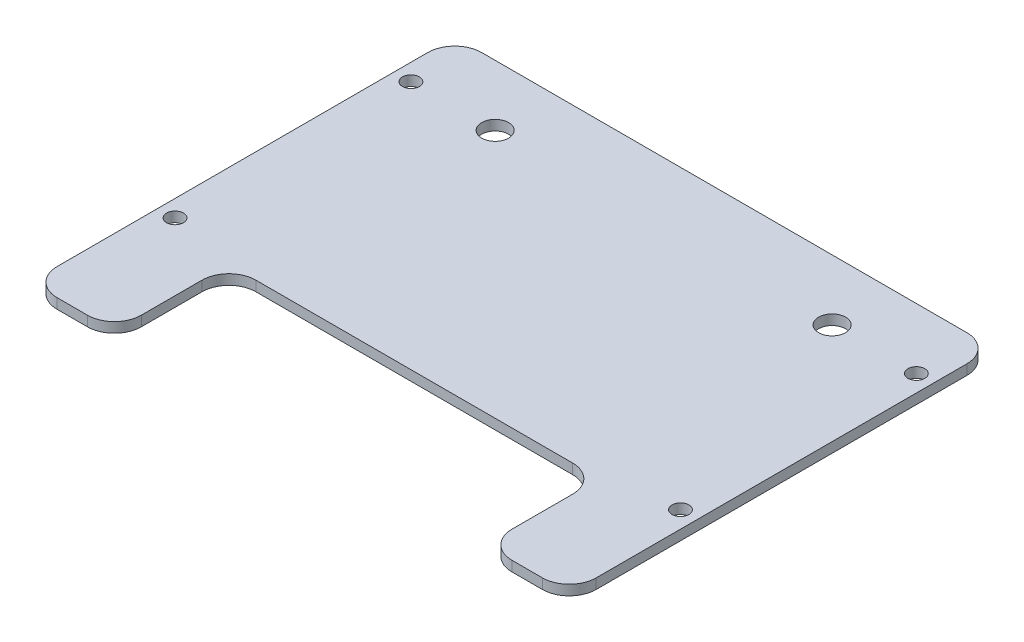
ISO-10303-21;
HEADER;
FILE_DESCRIPTION(('STEP AP214'),'2;1');
FILE_NAME('part.step','',(''),(''),'','','');
FILE_SCHEMA(('AUTOMOTIVE_DESIGN { 1 0 10303 214 1 1 1 1 }'));
ENDSEC;
DATA;
#1=APPLICATION_CONTEXT('core data for automotive mechanical design processes');
#2=APPLICATION_PROTOCOL_DEFINITION('international standard','automotive_design',2000,#1);
#3=PRODUCT_CONTEXT('',#1,'mechanical');
#4=PRODUCT('Part','Part','',(#3));
#5=PRODUCT_RELATED_PRODUCT_CATEGORY('part','',(#4));
#6=PRODUCT_DEFINITION_FORMATION('','',#4);
#7=PRODUCT_DEFINITION_CONTEXT('part definition',#1,'design');
#8=PRODUCT_DEFINITION('design','',#6,#7);
#9=PRODUCT_DEFINITION_SHAPE('','',#8);
#10=(LENGTH_UNIT() NAMED_UNIT(*) SI_UNIT(.MILLI.,.METRE.));
#11=(NAMED_UNIT(*) PLANE_ANGLE_UNIT() SI_UNIT($,.RADIAN.));
#12=(NAMED_UNIT(*) SI_UNIT($,.STERADIAN.) SOLID_ANGLE_UNIT());
#13=UNCERTAINTY_MEASURE_WITH_UNIT(LENGTH_MEASURE(1.E-05),#10,'distance_accuracy_value','');
#14=(GEOMETRIC_REPRESENTATION_CONTEXT(3) GLOBAL_UNCERTAINTY_ASSIGNED_CONTEXT((#13)) GLOBAL_UNIT_ASSIGNED_CONTEXT((#10,
#11,#12)) REPRESENTATION_CONTEXT('',''));
#15=CARTESIAN_POINT('',(0.,0.,0.));
#16=DIRECTION('',(0.,0.,1.));
#17=DIRECTION('',(1.,0.,0.));
#18=AXIS2_PLACEMENT_3D('',#15,#16,#17);
#19=CARTESIAN_POINT('',(-40.,1.5,63.));
#20=DIRECTION('',(0.,0.,-1.));
#21=DIRECTION('',(-1.,0.,0.));
#22=AXIS2_PLACEMENT_3D('',#19,#20,#21);
#23=PLANE('',#22);
#24=DIRECTION('',(1.,0.,0.));
#25=VECTOR('',#24,1.);
#26=CARTESIAN_POINT('',(-40.,0.,63.));
#27=LINE('',#26,#25);
#28=CARTESIAN_POINT('',(-36.,0.,63.));
#29=VERTEX_POINT('',#28);
#30=CARTESIAN_POINT('',(-31.5,0.,63.));
#31=VERTEX_POINT('',#30);
#32=EDGE_CURVE('E178',#29,#31,#27,.T.);
#33=ORIENTED_EDGE('',*,*,#32,.T.);
#34=DIRECTION('',(0.,1.,0.));
#35=VECTOR('',#34,1.);
#36=CARTESIAN_POINT('',(-31.5,1.5,63.));
#37=LINE('',#36,#35);
#38=CARTESIAN_POINT('',(-31.5,1.5,63.));
#39=VERTEX_POINT('',#38);
#40=EDGE_CURVE('E240',#31,#39,#37,.T.);
#41=ORIENTED_EDGE('',*,*,#40,.T.);
#42=DIRECTION('',(1.,0.,0.));
#43=VECTOR('',#42,1.);
#44=CARTESIAN_POINT('',(-40.,1.5,63.));
#45=LINE('',#44,#43);
#46=CARTESIAN_POINT('',(-36.,1.5,63.));
#47=VERTEX_POINT('',#46);
#48=EDGE_CURVE('E285',#47,#39,#45,.T.);
#49=ORIENTED_EDGE('',*,*,#48,.F.);
#50=DIRECTION('',(0.,-1.,0.));
#51=VECTOR('',#50,1.);
#52=CARTESIAN_POINT('',(-36.,1.5,63.));
#53=LINE('',#52,#51);
#54=EDGE_CURVE('E237',#47,#29,#53,.T.);
#55=ORIENTED_EDGE('',*,*,#54,.T.);
#56=EDGE_LOOP('',(#33,#41,#49,#55));
#57=FACE_BOUND('',#56,.T.);
#58=ADVANCED_FACE('F34',(#57),#23,.F.);
#59=CARTESIAN_POINT('',(-40.,1.5,63.));
#60=DIRECTION('',(1.,0.,0.));
#61=DIRECTION('',(0.,0.,-1.));
#62=AXIS2_PLACEMENT_3D('',#59,#60,#61);
#63=PLANE('',#62);
#64=DIRECTION('',(0.,0.,1.));
#65=VECTOR('',#64,1.);
#66=CARTESIAN_POINT('',(-40.,1.5,63.));
#67=LINE('',#66,#65);
#68=CARTESIAN_POINT('',(-40.,1.5,4.));
#69=VERTEX_POINT('',#68);
#70=CARTESIAN_POINT('',(-40.,1.5,59.));
#71=VERTEX_POINT('',#70);
#72=EDGE_CURVE('E168',#69,#71,#67,.T.);
#73=ORIENTED_EDGE('',*,*,#72,.F.);
#74=DIRECTION('',(0.,-1.,0.));
#75=VECTOR('',#74,1.);
#76=CARTESIAN_POINT('',(-40.,1.5,4.));
#77=LINE('',#76,#75);
#78=CARTESIAN_POINT('',(-40.,0.,4.));
#79=VERTEX_POINT('',#78);
#80=EDGE_CURVE('E152',#69,#79,#77,.T.);
#81=ORIENTED_EDGE('',*,*,#80,.T.);
#82=DIRECTION('',(0.,0.,1.));
#83=VECTOR('',#82,1.);
#84=CARTESIAN_POINT('',(-40.,0.,63.));
#85=LINE('',#84,#83);
#86=CARTESIAN_POINT('',(-40.,0.,59.));
#87=VERTEX_POINT('',#86);
#88=EDGE_CURVE('E165',#79,#87,#85,.T.);
#89=ORIENTED_EDGE('',*,*,#88,.T.);
#90=DIRECTION('',(0.,-1.,0.));
#91=VECTOR('',#90,1.);
#92=CARTESIAN_POINT('',(-40.,1.5,59.));
#93=LINE('',#92,#91);
#94=EDGE_CURVE('E170',#87,#71,#93,.F.);
#95=ORIENTED_EDGE('',*,*,#94,.T.);
#96=EDGE_LOOP('',(#73,#81,#89,#95));
#97=FACE_BOUND('',#96,.T.);
#98=ADVANCED_FACE('F164',(#97),#63,.F.);
#99=CARTESIAN_POINT('',(31.5,0.,63.));
#100=VERTEX_POINT('',#99);
#101=CARTESIAN_POINT('',(36.,0.,63.));
#102=VERTEX_POINT('',#101);
#103=EDGE_CURVE('E174',#100,#102,#27,.T.);
#104=ORIENTED_EDGE('',*,*,#103,.T.);
#105=DIRECTION('',(0.,-1.,0.));
#106=VECTOR('',#105,1.);
#107=CARTESIAN_POINT('',(36.,1.5,63.));
#108=LINE('',#107,#106);
#109=CARTESIAN_POINT('',(36.,1.5,63.));
#110=VERTEX_POINT('',#109);
#111=EDGE_CURVE('E230',#102,#110,#108,.F.);
#112=ORIENTED_EDGE('',*,*,#111,.T.);
#113=CARTESIAN_POINT('',(31.5,1.5,63.));
#114=VERTEX_POINT('',#113);
#115=EDGE_CURVE('E284',#114,#110,#45,.T.);
#116=ORIENTED_EDGE('',*,*,#115,.F.);
#117=DIRECTION('',(0.,1.,0.));
#118=VECTOR('',#117,1.);
#119=CARTESIAN_POINT('',(31.5,1.5,63.));
#120=LINE('',#119,#118);
#121=EDGE_CURVE('E228',#114,#100,#120,.F.);
#122=ORIENTED_EDGE('',*,*,#121,.T.);
#123=EDGE_LOOP('',(#104,#112,#116,#122));
#124=FACE_BOUND('',#123,.T.);
#125=ADVANCED_FACE('F311',(#124),#23,.F.);
#126=CARTESIAN_POINT('',(40.,1.5,63.));
#127=DIRECTION('',(-1.,0.,0.));
#128=DIRECTION('',(0.,0.,1.));
#129=AXIS2_PLACEMENT_3D('',#126,#127,#128);
#130=PLANE('',#129);
#131=DIRECTION('',(0.,0.,-1.));
#132=VECTOR('',#131,1.);
#133=CARTESIAN_POINT('',(40.,0.,63.));
#134=LINE('',#133,#132);
#135=CARTESIAN_POINT('',(40.,0.,59.));
#136=VERTEX_POINT('',#135);
#137=CARTESIAN_POINT('',(40.,0.,4.));
#138=VERTEX_POINT('',#137);
#139=EDGE_CURVE('E187',#136,#138,#134,.T.);
#140=ORIENTED_EDGE('',*,*,#139,.T.);
#141=DIRECTION('',(0.,-1.,0.));
#142=VECTOR('',#141,1.);
#143=CARTESIAN_POINT('',(40.,1.5,4.));
#144=LINE('',#143,#142);
#145=CARTESIAN_POINT('',(40.,1.5,4.));
#146=VERTEX_POINT('',#145);
#147=EDGE_CURVE('E49',#138,#146,#144,.F.);
#148=ORIENTED_EDGE('',*,*,#147,.T.);
#149=DIRECTION('',(0.,0.,-1.));
#150=VECTOR('',#149,1.);
#151=CARTESIAN_POINT('',(40.,1.5,63.));
#152=LINE('',#151,#150);
#153=CARTESIAN_POINT('',(40.,1.5,59.));
#154=VERTEX_POINT('',#153);
#155=EDGE_CURVE('E286',#154,#146,#152,.T.);
#156=ORIENTED_EDGE('',*,*,#155,.F.);
#157=DIRECTION('',(0.,-1.,0.));
#158=VECTOR('',#157,1.);
#159=CARTESIAN_POINT('',(40.,1.5,59.));
#160=LINE('',#159,#158);
#161=EDGE_CURVE('E224',#154,#136,#160,.T.);
#162=ORIENTED_EDGE('',*,*,#161,.T.);
#163=EDGE_LOOP('',(#140,#148,#156,#162));
#164=FACE_BOUND('',#163,.T.);
#165=ADVANCED_FACE('F303',(#164),#130,.F.);
#166=CARTESIAN_POINT('',(-40.,1.5,0.));
#167=DIRECTION('',(0.,0.,1.));
#168=DIRECTION('',(1.,0.,0.));
#169=AXIS2_PLACEMENT_3D('',#166,#167,#168);
#170=PLANE('',#169);
#171=DIRECTION('',(-1.,0.,0.));
#172=VECTOR('',#171,1.);
#173=CARTESIAN_POINT('',(-40.,0.,0.));
#174=LINE('',#173,#172);
#175=CARTESIAN_POINT('',(36.,0.,0.));
#176=VERTEX_POINT('',#175);
#177=CARTESIAN_POINT('',(-36.,0.,0.));
#178=VERTEX_POINT('',#177);
#179=EDGE_CURVE('E189',#176,#178,#174,.T.);
#180=ORIENTED_EDGE('',*,*,#179,.T.);
#181=DIRECTION('',(0.,-1.,0.));
#182=VECTOR('',#181,1.);
#183=CARTESIAN_POINT('',(-36.,1.5,0.));
#184=LINE('',#183,#182);
#185=CARTESIAN_POINT('',(-36.,1.5,0.));
#186=VERTEX_POINT('',#185);
#187=EDGE_CURVE('E153',#178,#186,#184,.F.);
#188=ORIENTED_EDGE('',*,*,#187,.T.);
#189=DIRECTION('',(-1.,0.,0.));
#190=VECTOR('',#189,1.);
#191=CARTESIAN_POINT('',(-40.,1.5,0.));
#192=LINE('',#191,#190);
#193=CARTESIAN_POINT('',(36.,1.5,0.));
#194=VERTEX_POINT('',#193);
#195=EDGE_CURVE('E184',#194,#186,#192,.T.);
#196=ORIENTED_EDGE('',*,*,#195,.F.);
#197=DIRECTION('',(0.,-1.,0.));
#198=VECTOR('',#197,1.);
#199=CARTESIAN_POINT('',(36.,1.5,0.));
#200=LINE('',#199,#198);
#201=EDGE_CURVE('E158',#194,#176,#200,.T.);
#202=ORIENTED_EDGE('',*,*,#201,.T.);
#203=EDGE_LOOP('',(#180,#188,#196,#202));
#204=FACE_BOUND('',#203,.T.);
#205=ADVANCED_FACE('F299',(#204),#170,.F.);
#206=CARTESIAN_POINT('',(0.,1.5,0.));
#207=DIRECTION('',(0.,-1.,0.));
#208=DIRECTION('',(0.,0.,-1.));
#209=AXIS2_PLACEMENT_3D('',#206,#207,#208);
#210=PLANE('',#209);
#211=CARTESIAN_POINT('',(37.5,1.5,44.));
#212=DIRECTION('',(0.,1.,0.));
#213=DIRECTION('',(0.,0.,-1.));
#214=AXIS2_PLACEMENT_3D('',#211,#212,#213);
#215=CIRCLE('',#214,1.25);
#216=CARTESIAN_POINT('',(37.5,1.5,42.75));
#217=VERTEX_POINT('',#216);
#218=EDGE_CURVE('E392',#217,#217,#215,.T.);
#219=ORIENTED_EDGE('',*,*,#218,.F.);
#220=EDGE_LOOP('',(#219));
#221=FACE_BOUND('',#220,.T.);
#222=CARTESIAN_POINT('',(37.5,1.5,9.00000000000001));
#223=DIRECTION('',(0.,1.,0.));
#224=DIRECTION('',(0.,0.,-1.));
#225=AXIS2_PLACEMENT_3D('',#222,#223,#224);
#226=CIRCLE('',#225,1.25);
#227=CARTESIAN_POINT('',(37.5,1.5,7.75));
#228=VERTEX_POINT('',#227);
#229=EDGE_CURVE('E394',#228,#228,#226,.T.);
#230=ORIENTED_EDGE('',*,*,#229,.F.);
#231=EDGE_LOOP('',(#230));
#232=FACE_BOUND('',#231,.T.);
#233=CARTESIAN_POINT('',(25.,1.5,9.00000000000001));
#234=DIRECTION('',(0.,1.,0.));
#235=DIRECTION('',(0.,0.,-1.));
#236=AXIS2_PLACEMENT_3D('',#233,#234,#235);
#237=CIRCLE('',#236,2.);
#238=CARTESIAN_POINT('',(25.,1.5,7.00000000000001));
#239=VERTEX_POINT('',#238);
#240=EDGE_CURVE('E400',#239,#239,#237,.T.);
#241=ORIENTED_EDGE('',*,*,#240,.F.);
#242=EDGE_LOOP('',(#241));
#243=FACE_BOUND('',#242,.T.);
#244=CARTESIAN_POINT('',(-25.,1.5,9.00000000000001));
#245=DIRECTION('',(0.,1.,0.));
#246=DIRECTION('',(0.,0.,1.));
#247=AXIS2_PLACEMENT_3D('',#244,#245,#246);
#248=CIRCLE('',#247,2.);
#249=CARTESIAN_POINT('',(-25.,1.5,11.));
#250=VERTEX_POINT('',#249);
#251=EDGE_CURVE('E406',#250,#250,#248,.T.);
#252=ORIENTED_EDGE('',*,*,#251,.F.);
#253=EDGE_LOOP('',(#252));
#254=FACE_BOUND('',#253,.T.);
#255=CARTESIAN_POINT('',(-37.5,1.5,9.00000000000001));
#256=DIRECTION('',(0.,1.,0.));
#257=DIRECTION('',(0.,0.,1.));
#258=AXIS2_PLACEMENT_3D('',#255,#256,#257);
#259=CIRCLE('',#258,1.25);
#260=CARTESIAN_POINT('',(-37.5,1.5,10.25));
#261=VERTEX_POINT('',#260);
#262=EDGE_CURVE('E412',#261,#261,#259,.T.);
#263=ORIENTED_EDGE('',*,*,#262,.F.);
#264=EDGE_LOOP('',(#263));
#265=FACE_BOUND('',#264,.T.);
#266=CARTESIAN_POINT('',(-37.5,1.5,44.));
#267=DIRECTION('',(0.,1.,0.));
#268=DIRECTION('',(0.,0.,1.));
#269=AXIS2_PLACEMENT_3D('',#266,#267,#268);
#270=CIRCLE('',#269,1.25);
#271=CARTESIAN_POINT('',(-37.5,1.5,45.25));
#272=VERTEX_POINT('',#271);
#273=EDGE_CURVE('E276',#272,#272,#270,.T.);
#274=ORIENTED_EDGE('',*,*,#273,.F.);
#275=EDGE_LOOP('',(#274));
#276=FACE_BOUND('',#275,.T.);
#277=ORIENTED_EDGE('',*,*,#195,.T.);
#278=CARTESIAN_POINT('',(-36.,1.5,4.));
#279=DIRECTION('',(0.,-1.,0.));
#280=DIRECTION('',(0.,0.,-1.));
#281=AXIS2_PLACEMENT_3D('',#278,#279,#280);
#282=CIRCLE('',#281,4.);
#283=EDGE_CURVE('E212',#186,#69,#282,.F.);
#284=ORIENTED_EDGE('',*,*,#283,.T.);
#285=ORIENTED_EDGE('',*,*,#72,.T.);
#286=CARTESIAN_POINT('',(-36.,1.5,59.));
#287=DIRECTION('',(0.,-1.,0.));
#288=DIRECTION('',(0.,0.,-1.));
#289=AXIS2_PLACEMENT_3D('',#286,#287,#288);
#290=CIRCLE('',#289,4.);
#291=EDGE_CURVE('E203',#71,#47,#290,.F.);
#292=ORIENTED_EDGE('',*,*,#291,.T.);
#293=ORIENTED_EDGE('',*,*,#48,.T.);
#294=CARTESIAN_POINT('',(-31.5,1.5,59.));
#295=DIRECTION('',(0.,-1.,0.));
#296=DIRECTION('',(0.,0.,-1.));
#297=AXIS2_PLACEMENT_3D('',#294,#295,#296);
#298=CIRCLE('',#297,4.);
#299=CARTESIAN_POINT('',(-27.5,1.5,59.));
#300=VERTEX_POINT('',#299);
#301=EDGE_CURVE('E205',#39,#300,#298,.F.);
#302=ORIENTED_EDGE('',*,*,#301,.T.);
#303=DIRECTION('',(0.,0.,1.));
#304=VECTOR('',#303,1.);
#305=CARTESIAN_POINT('',(-27.5,1.5,63.));
#306=LINE('',#305,#304);
#307=CARTESIAN_POINT('',(-27.5,1.5,50.));
#308=VERTEX_POINT('',#307);
#309=EDGE_CURVE('E253',#308,#300,#306,.T.);
#310=ORIENTED_EDGE('',*,*,#309,.F.);
#311=CARTESIAN_POINT('',(-23.5,1.5,50.));
#312=DIRECTION('',(0.,-1.,0.));
#313=DIRECTION('',(0.,0.,-1.));
#314=AXIS2_PLACEMENT_3D('',#311,#312,#313);
#315=CIRCLE('',#314,4.);
#316=CARTESIAN_POINT('',(-23.5,1.5,46.));
#317=VERTEX_POINT('',#316);
#318=EDGE_CURVE('E42',#308,#317,#315,.T.);
#319=ORIENTED_EDGE('',*,*,#318,.T.);
#320=DIRECTION('',(-1.,0.,0.));
#321=VECTOR('',#320,1.);
#322=CARTESIAN_POINT('',(-27.5,1.5,46.));
#323=LINE('',#322,#321);
#324=CARTESIAN_POINT('',(23.5,1.5,46.));
#325=VERTEX_POINT('',#324);
#326=EDGE_CURVE('E251',#325,#317,#323,.T.);
#327=ORIENTED_EDGE('',*,*,#326,.F.);
#328=CARTESIAN_POINT('',(23.5,1.5,50.));
#329=DIRECTION('',(0.,-1.,0.));
#330=DIRECTION('',(0.,0.,-1.));
#331=AXIS2_PLACEMENT_3D('',#328,#329,#330);
#332=CIRCLE('',#331,4.);
#333=CARTESIAN_POINT('',(27.5,1.5,50.));
#334=VERTEX_POINT('',#333);
#335=EDGE_CURVE('E243',#325,#334,#332,.T.);
#336=ORIENTED_EDGE('',*,*,#335,.T.);
#337=DIRECTION('',(0.,0.,-1.));
#338=VECTOR('',#337,1.);
#339=CARTESIAN_POINT('',(27.5,1.5,63.));
#340=LINE('',#339,#338);
#341=CARTESIAN_POINT('',(27.5,1.5,59.));
#342=VERTEX_POINT('',#341);
#343=EDGE_CURVE('E262',#342,#334,#340,.T.);
#344=ORIENTED_EDGE('',*,*,#343,.F.);
#345=CARTESIAN_POINT('',(31.5,1.5,59.));
#346=DIRECTION('',(0.,-1.,0.));
#347=DIRECTION('',(0.,0.,-1.));
#348=AXIS2_PLACEMENT_3D('',#345,#346,#347);
#349=CIRCLE('',#348,4.);
#350=EDGE_CURVE('E207',#342,#114,#349,.F.);
#351=ORIENTED_EDGE('',*,*,#350,.T.);
#352=ORIENTED_EDGE('',*,*,#115,.T.);
#353=CARTESIAN_POINT('',(36.,1.5,59.));
#354=DIRECTION('',(0.,-1.,0.));
#355=DIRECTION('',(0.,0.,-1.));
#356=AXIS2_PLACEMENT_3D('',#353,#354,#355);
#357=CIRCLE('',#356,4.);
#358=EDGE_CURVE('E56',#110,#154,#357,.F.);
#359=ORIENTED_EDGE('',*,*,#358,.T.);
#360=ORIENTED_EDGE('',*,*,#155,.T.);
#361=CARTESIAN_POINT('',(36.,1.5,4.));
#362=DIRECTION('',(0.,-1.,0.));
#363=DIRECTION('',(0.,0.,-1.));
#364=AXIS2_PLACEMENT_3D('',#361,#362,#363);
#365=CIRCLE('',#364,4.);
#366=EDGE_CURVE('E210',#146,#194,#365,.F.);
#367=ORIENTED_EDGE('',*,*,#366,.T.);
#368=EDGE_LOOP('',(#277,#284,#285,#292,#293,#302,#310,#319,#327,#336,#344,#351,#352,#359,#360,#367));
#369=FACE_BOUND('',#368,.T.);
#370=ADVANCED_FACE('F250',(#221,#232,#243,#254,#265,#276,#369),#210,.F.);
#371=CARTESIAN_POINT('',(0.,0.,0.));
#372=DIRECTION('',(0.,-1.,0.));
#373=DIRECTION('',(0.,0.,-1.));
#374=AXIS2_PLACEMENT_3D('',#371,#372,#373);
#375=PLANE('',#374);
#376=CARTESIAN_POINT('',(37.5,0.,44.));
#377=DIRECTION('',(0.,1.,0.));
#378=DIRECTION('',(0.,0.,-1.));
#379=AXIS2_PLACEMENT_3D('',#376,#377,#378);
#380=CIRCLE('',#379,1.25);
#381=CARTESIAN_POINT('',(37.5,0.,42.75));
#382=VERTEX_POINT('',#381);
#383=EDGE_CURVE('E389',#382,#382,#380,.T.);
#384=ORIENTED_EDGE('',*,*,#383,.T.);
#385=EDGE_LOOP('',(#384));
#386=FACE_BOUND('',#385,.T.);
#387=CARTESIAN_POINT('',(37.5,0.,9.00000000000001));
#388=DIRECTION('',(0.,1.,0.));
#389=DIRECTION('',(0.,0.,-1.));
#390=AXIS2_PLACEMENT_3D('',#387,#388,#389);
#391=CIRCLE('',#390,1.25);
#392=CARTESIAN_POINT('',(37.5,0.,7.75));
#393=VERTEX_POINT('',#392);
#394=EDGE_CURVE('E397',#393,#393,#391,.T.);
#395=ORIENTED_EDGE('',*,*,#394,.T.);
#396=EDGE_LOOP('',(#395));
#397=FACE_BOUND('',#396,.T.);
#398=CARTESIAN_POINT('',(25.,0.,9.00000000000001));
#399=DIRECTION('',(0.,1.,0.));
#400=DIRECTION('',(0.,0.,-1.));
#401=AXIS2_PLACEMENT_3D('',#398,#399,#400);
#402=CIRCLE('',#401,2.);
#403=CARTESIAN_POINT('',(25.,0.,7.00000000000001));
#404=VERTEX_POINT('',#403);
#405=EDGE_CURVE('E403',#404,#404,#402,.T.);
#406=ORIENTED_EDGE('',*,*,#405,.T.);
#407=EDGE_LOOP('',(#406));
#408=FACE_BOUND('',#407,.T.);
#409=CARTESIAN_POINT('',(-25.,0.,9.00000000000001));
#410=DIRECTION('',(0.,1.,0.));
#411=DIRECTION('',(0.,0.,1.));
#412=AXIS2_PLACEMENT_3D('',#409,#410,#411);
#413=CIRCLE('',#412,2.);
#414=CARTESIAN_POINT('',(-25.,0.,11.));
#415=VERTEX_POINT('',#414);
#416=EDGE_CURVE('E409',#415,#415,#413,.T.);
#417=ORIENTED_EDGE('',*,*,#416,.T.);
#418=EDGE_LOOP('',(#417));
#419=FACE_BOUND('',#418,.T.);
#420=CARTESIAN_POINT('',(-37.5,0.,9.00000000000001));
#421=DIRECTION('',(0.,1.,0.));
#422=DIRECTION('',(0.,0.,1.));
#423=AXIS2_PLACEMENT_3D('',#420,#421,#422);
#424=CIRCLE('',#423,1.25);
#425=CARTESIAN_POINT('',(-37.5,0.,10.25));
#426=VERTEX_POINT('',#425);
#427=EDGE_CURVE('E415',#426,#426,#424,.T.);
#428=ORIENTED_EDGE('',*,*,#427,.T.);
#429=EDGE_LOOP('',(#428));
#430=FACE_BOUND('',#429,.T.);
#431=CARTESIAN_POINT('',(-37.5,0.,44.));
#432=DIRECTION('',(0.,1.,0.));
#433=DIRECTION('',(0.,0.,1.));
#434=AXIS2_PLACEMENT_3D('',#431,#432,#433);
#435=CIRCLE('',#434,1.25);
#436=CARTESIAN_POINT('',(-37.5,0.,45.25));
#437=VERTEX_POINT('',#436);
#438=EDGE_CURVE('E280',#437,#437,#435,.T.);
#439=ORIENTED_EDGE('',*,*,#438,.T.);
#440=EDGE_LOOP('',(#439));
#441=FACE_BOUND('',#440,.T.);
#442=ORIENTED_EDGE('',*,*,#88,.F.);
#443=CARTESIAN_POINT('',(-36.,0.,4.));
#444=DIRECTION('',(0.,-1.,0.));
#445=DIRECTION('',(0.,0.,-1.));
#446=AXIS2_PLACEMENT_3D('',#443,#444,#445);
#447=CIRCLE('',#446,4.);
#448=EDGE_CURVE('E148',#79,#178,#447,.T.);
#449=ORIENTED_EDGE('',*,*,#448,.T.);
#450=ORIENTED_EDGE('',*,*,#179,.F.);
#451=CARTESIAN_POINT('',(36.,0.,4.));
#452=DIRECTION('',(0.,-1.,0.));
#453=DIRECTION('',(0.,0.,-1.));
#454=AXIS2_PLACEMENT_3D('',#451,#452,#453);
#455=CIRCLE('',#454,4.);
#456=EDGE_CURVE('E159',#176,#138,#455,.T.);
#457=ORIENTED_EDGE('',*,*,#456,.T.);
#458=ORIENTED_EDGE('',*,*,#139,.F.);
#459=CARTESIAN_POINT('',(36.,0.,59.));
#460=DIRECTION('',(0.,-1.,0.));
#461=DIRECTION('',(0.,0.,-1.));
#462=AXIS2_PLACEMENT_3D('',#459,#460,#461);
#463=CIRCLE('',#462,4.);
#464=EDGE_CURVE('E197',#136,#102,#463,.T.);
#465=ORIENTED_EDGE('',*,*,#464,.T.);
#466=ORIENTED_EDGE('',*,*,#103,.F.);
#467=CARTESIAN_POINT('',(31.5,0.,59.));
#468=DIRECTION('',(0.,-1.,0.));
#469=DIRECTION('',(0.,0.,-1.));
#470=AXIS2_PLACEMENT_3D('',#467,#468,#469);
#471=CIRCLE('',#470,4.);
#472=CARTESIAN_POINT('',(27.5,0.,59.));
#473=VERTEX_POINT('',#472);
#474=EDGE_CURVE('E195',#100,#473,#471,.T.);
#475=ORIENTED_EDGE('',*,*,#474,.T.);
#476=DIRECTION('',(0.,0.,-1.));
#477=VECTOR('',#476,1.);
#478=CARTESIAN_POINT('',(27.5,0.,63.));
#479=LINE('',#478,#477);
#480=CARTESIAN_POINT('',(27.5,0.,50.));
#481=VERTEX_POINT('',#480);
#482=EDGE_CURVE('E181',#473,#481,#479,.T.);
#483=ORIENTED_EDGE('',*,*,#482,.T.);
#484=CARTESIAN_POINT('',(23.5,0.,50.));
#485=DIRECTION('',(0.,-1.,0.));
#486=DIRECTION('',(0.,0.,-1.));
#487=AXIS2_PLACEMENT_3D('',#484,#485,#486);
#488=CIRCLE('',#487,4.);
#489=CARTESIAN_POINT('',(23.5,0.,46.));
#490=VERTEX_POINT('',#489);
#491=EDGE_CURVE('E245',#481,#490,#488,.F.);
#492=ORIENTED_EDGE('',*,*,#491,.T.);
#493=DIRECTION('',(-1.,0.,0.));
#494=VECTOR('',#493,1.);
#495=CARTESIAN_POINT('',(-27.5,0.,46.));
#496=LINE('',#495,#494);
#497=CARTESIAN_POINT('',(-23.5,0.,46.));
#498=VERTEX_POINT('',#497);
#499=EDGE_CURVE('E175',#490,#498,#496,.T.);
#500=ORIENTED_EDGE('',*,*,#499,.T.);
#501=CARTESIAN_POINT('',(-23.5,0.,50.));
#502=DIRECTION('',(0.,-1.,0.));
#503=DIRECTION('',(0.,0.,-1.));
#504=AXIS2_PLACEMENT_3D('',#501,#502,#503);
#505=CIRCLE('',#504,4.);
#506=CARTESIAN_POINT('',(-27.5,0.,50.));
#507=VERTEX_POINT('',#506);
#508=EDGE_CURVE('E11',#498,#507,#505,.F.);
#509=ORIENTED_EDGE('',*,*,#508,.T.);
#510=DIRECTION('',(0.,0.,1.));
#511=VECTOR('',#510,1.);
#512=CARTESIAN_POINT('',(-27.5,0.,63.));
#513=LINE('',#512,#511);
#514=CARTESIAN_POINT('',(-27.5,0.,59.));
#515=VERTEX_POINT('',#514);
#516=EDGE_CURVE('E261',#507,#515,#513,.T.);
#517=ORIENTED_EDGE('',*,*,#516,.T.);
#518=CARTESIAN_POINT('',(-31.5,0.,59.));
#519=DIRECTION('',(0.,-1.,0.));
#520=DIRECTION('',(0.,0.,-1.));
#521=AXIS2_PLACEMENT_3D('',#518,#519,#520);
#522=CIRCLE('',#521,4.);
#523=EDGE_CURVE('E193',#515,#31,#522,.T.);
#524=ORIENTED_EDGE('',*,*,#523,.T.);
#525=ORIENTED_EDGE('',*,*,#32,.F.);
#526=CARTESIAN_POINT('',(-36.,0.,59.));
#527=DIRECTION('',(0.,-1.,0.));
#528=DIRECTION('',(0.,0.,-1.));
#529=AXIS2_PLACEMENT_3D('',#526,#527,#528);
#530=CIRCLE('',#529,4.);
#531=EDGE_CURVE('E169',#29,#87,#530,.T.);
#532=ORIENTED_EDGE('',*,*,#531,.T.);
#533=EDGE_LOOP('',(#442,#449,#450,#457,#458,#465,#466,#475,#483,#492,#500,#509,#517,#524,#525,#532));
#534=FACE_BOUND('',#533,.T.);
#535=ADVANCED_FACE('F172',(#386,#397,#408,#419,#430,#441,#534),#375,.T.);
#536=CARTESIAN_POINT('',(-27.5,0.,63.));
#537=DIRECTION('',(-1.,0.,0.));
#538=DIRECTION('',(0.,0.,1.));
#539=AXIS2_PLACEMENT_3D('',#536,#537,#538);
#540=PLANE('',#539);
#541=ORIENTED_EDGE('',*,*,#516,.F.);
#542=DIRECTION('',(0.,1.,0.));
#543=VECTOR('',#542,1.);
#544=CARTESIAN_POINT('',(-27.5,1.5,50.));
#545=LINE('',#544,#543);
#546=EDGE_CURVE('E234',#507,#308,#545,.T.);
#547=ORIENTED_EDGE('',*,*,#546,.T.);
#548=ORIENTED_EDGE('',*,*,#309,.T.);
#549=DIRECTION('',(0.,1.,0.));
#550=VECTOR('',#549,1.);
#551=CARTESIAN_POINT('',(-27.5,0.,59.));
#552=LINE('',#551,#550);
#553=EDGE_CURVE('E232',#300,#515,#552,.F.);
#554=ORIENTED_EDGE('',*,*,#553,.T.);
#555=EDGE_LOOP('',(#541,#547,#548,#554));
#556=FACE_BOUND('',#555,.T.);
#557=ADVANCED_FACE('F270',(#556),#540,.F.);
#558=CARTESIAN_POINT('',(-27.5,0.,46.));
#559=DIRECTION('',(0.,0.,-1.));
#560=DIRECTION('',(-1.,0.,0.));
#561=AXIS2_PLACEMENT_3D('',#558,#559,#560);
#562=PLANE('',#561);
#563=ORIENTED_EDGE('',*,*,#499,.F.);
#564=DIRECTION('',(0.,1.,0.));
#565=VECTOR('',#564,1.);
#566=CARTESIAN_POINT('',(23.5,1.5,46.));
#567=LINE('',#566,#565);
#568=EDGE_CURVE('E216',#490,#325,#567,.T.);
#569=ORIENTED_EDGE('',*,*,#568,.T.);
#570=ORIENTED_EDGE('',*,*,#326,.T.);
#571=DIRECTION('',(0.,1.,0.));
#572=VECTOR('',#571,1.);
#573=CARTESIAN_POINT('',(-23.5,0.,46.));
#574=LINE('',#573,#572);
#575=EDGE_CURVE('E214',#317,#498,#574,.F.);
#576=ORIENTED_EDGE('',*,*,#575,.T.);
#577=EDGE_LOOP('',(#563,#569,#570,#576));
#578=FACE_BOUND('',#577,.T.);
#579=ADVANCED_FACE('F259',(#578),#562,.F.);
#580=CARTESIAN_POINT('',(27.5,0.,63.));
#581=DIRECTION('',(1.,0.,0.));
#582=DIRECTION('',(0.,0.,-1.));
#583=AXIS2_PLACEMENT_3D('',#580,#581,#582);
#584=PLANE('',#583);
#585=ORIENTED_EDGE('',*,*,#343,.T.);
#586=DIRECTION('',(0.,1.,0.));
#587=VECTOR('',#586,1.);
#588=CARTESIAN_POINT('',(27.5,0.,50.));
#589=LINE('',#588,#587);
#590=EDGE_CURVE('E222',#334,#481,#589,.F.);
#591=ORIENTED_EDGE('',*,*,#590,.T.);
#592=ORIENTED_EDGE('',*,*,#482,.F.);
#593=DIRECTION('',(0.,1.,0.));
#594=VECTOR('',#593,1.);
#595=CARTESIAN_POINT('',(27.5,0.,59.));
#596=LINE('',#595,#594);
#597=EDGE_CURVE('E219',#473,#342,#596,.T.);
#598=ORIENTED_EDGE('',*,*,#597,.T.);
#599=EDGE_LOOP('',(#585,#591,#592,#598));
#600=FACE_BOUND('',#599,.T.);
#601=ADVANCED_FACE('F320',(#600),#584,.F.);
#602=CARTESIAN_POINT('',(-37.5,0.,44.));
#603=DIRECTION('',(0.,1.,0.));
#604=DIRECTION('',(0.,0.,1.));
#605=AXIS2_PLACEMENT_3D('',#602,#603,#604);
#606=CYLINDRICAL_SURFACE('',#605,1.25);
#607=ORIENTED_EDGE('',*,*,#438,.F.);
#608=EDGE_LOOP('',(#607));
#609=FACE_BOUND('',#608,.T.);
#610=ORIENTED_EDGE('',*,*,#273,.T.);
#611=EDGE_LOOP('',(#610));
#612=FACE_BOUND('',#611,.T.);
#613=ADVANCED_FACE('F360',(#609,#612),#606,.F.);
#614=CARTESIAN_POINT('',(-37.5,0.,9.00000000000001));
#615=DIRECTION('',(0.,1.,0.));
#616=DIRECTION('',(0.,0.,1.));
#617=AXIS2_PLACEMENT_3D('',#614,#615,#616);
#618=CYLINDRICAL_SURFACE('',#617,1.25);
#619=ORIENTED_EDGE('',*,*,#427,.F.);
#620=EDGE_LOOP('',(#619));
#621=FACE_BOUND('',#620,.T.);
#622=ORIENTED_EDGE('',*,*,#262,.T.);
#623=EDGE_LOOP('',(#622));
#624=FACE_BOUND('',#623,.T.);
#625=ADVANCED_FACE('F365',(#621,#624),#618,.F.);
#626=CARTESIAN_POINT('',(-25.,0.,9.00000000000001));
#627=DIRECTION('',(0.,1.,0.));
#628=DIRECTION('',(0.,0.,1.));
#629=AXIS2_PLACEMENT_3D('',#626,#627,#628);
#630=CYLINDRICAL_SURFACE('',#629,2.);
#631=ORIENTED_EDGE('',*,*,#416,.F.);
#632=EDGE_LOOP('',(#631));
#633=FACE_BOUND('',#632,.T.);
#634=ORIENTED_EDGE('',*,*,#251,.T.);
#635=EDGE_LOOP('',(#634));
#636=FACE_BOUND('',#635,.T.);
#637=ADVANCED_FACE('F369',(#633,#636),#630,.F.);
#638=CARTESIAN_POINT('',(25.,0.,9.00000000000001));
#639=DIRECTION('',(0.,1.,0.));
#640=DIRECTION('',(0.,0.,1.));
#641=AXIS2_PLACEMENT_3D('',#638,#639,#640);
#642=CYLINDRICAL_SURFACE('',#641,2.);
#643=ORIENTED_EDGE('',*,*,#405,.F.);
#644=EDGE_LOOP('',(#643));
#645=FACE_BOUND('',#644,.T.);
#646=ORIENTED_EDGE('',*,*,#240,.T.);
#647=EDGE_LOOP('',(#646));
#648=FACE_BOUND('',#647,.T.);
#649=ADVANCED_FACE('F373',(#645,#648),#642,.F.);
#650=CARTESIAN_POINT('',(37.5,0.,9.00000000000001));
#651=DIRECTION('',(0.,1.,0.));
#652=DIRECTION('',(0.,0.,1.));
#653=AXIS2_PLACEMENT_3D('',#650,#651,#652);
#654=CYLINDRICAL_SURFACE('',#653,1.25);
#655=ORIENTED_EDGE('',*,*,#394,.F.);
#656=EDGE_LOOP('',(#655));
#657=FACE_BOUND('',#656,.T.);
#658=ORIENTED_EDGE('',*,*,#229,.T.);
#659=EDGE_LOOP('',(#658));
#660=FACE_BOUND('',#659,.T.);
#661=ADVANCED_FACE('F377',(#657,#660),#654,.F.);
#662=CARTESIAN_POINT('',(37.5,0.,44.));
#663=DIRECTION('',(0.,1.,0.));
#664=DIRECTION('',(0.,0.,1.));
#665=AXIS2_PLACEMENT_3D('',#662,#663,#664);
#666=CYLINDRICAL_SURFACE('',#665,1.25);
#667=ORIENTED_EDGE('',*,*,#383,.F.);
#668=EDGE_LOOP('',(#667));
#669=FACE_BOUND('',#668,.T.);
#670=ORIENTED_EDGE('',*,*,#218,.T.);
#671=EDGE_LOOP('',(#670));
#672=FACE_BOUND('',#671,.T.);
#673=ADVANCED_FACE('F332',(#669,#672),#666,.F.);
#674=CARTESIAN_POINT('',(-36.,1.5,4.));
#675=DIRECTION('',(0.,-1.,0.));
#676=DIRECTION('',(0.,0.,-1.));
#677=AXIS2_PLACEMENT_3D('',#674,#675,#676);
#678=CYLINDRICAL_SURFACE('',#677,4.);
#679=ORIENTED_EDGE('',*,*,#283,.F.);
#680=ORIENTED_EDGE('',*,*,#187,.F.);
#681=ORIENTED_EDGE('',*,*,#448,.F.);
#682=ORIENTED_EDGE('',*,*,#80,.F.);
#683=EDGE_LOOP('',(#679,#680,#681,#682));
#684=FACE_BOUND('',#683,.T.);
#685=ADVANCED_FACE('F151',(#684),#678,.T.);
#686=CARTESIAN_POINT('',(23.5,0.,50.));
#687=DIRECTION('',(0.,-1.,0.));
#688=DIRECTION('',(0.,0.,-1.));
#689=AXIS2_PLACEMENT_3D('',#686,#687,#688);
#690=CYLINDRICAL_SURFACE('',#689,4.);
#691=ORIENTED_EDGE('',*,*,#491,.F.);
#692=ORIENTED_EDGE('',*,*,#590,.F.);
#693=ORIENTED_EDGE('',*,*,#335,.F.);
#694=ORIENTED_EDGE('',*,*,#568,.F.);
#695=EDGE_LOOP('',(#691,#692,#693,#694));
#696=FACE_BOUND('',#695,.T.);
#697=ADVANCED_FACE('F324',(#696),#690,.F.);
#698=CARTESIAN_POINT('',(36.,1.5,4.));
#699=DIRECTION('',(0.,-1.,0.));
#700=DIRECTION('',(0.,0.,-1.));
#701=AXIS2_PLACEMENT_3D('',#698,#699,#700);
#702=CYLINDRICAL_SURFACE('',#701,4.);
#703=ORIENTED_EDGE('',*,*,#366,.F.);
#704=ORIENTED_EDGE('',*,*,#147,.F.);
#705=ORIENTED_EDGE('',*,*,#456,.F.);
#706=ORIENTED_EDGE('',*,*,#201,.F.);
#707=EDGE_LOOP('',(#703,#704,#705,#706));
#708=FACE_BOUND('',#707,.T.);
#709=ADVANCED_FACE('F301',(#708),#702,.T.);
#710=CARTESIAN_POINT('',(36.,1.5,59.));
#711=DIRECTION('',(0.,-1.,0.));
#712=DIRECTION('',(0.,0.,-1.));
#713=AXIS2_PLACEMENT_3D('',#710,#711,#712);
#714=CYLINDRICAL_SURFACE('',#713,4.);
#715=ORIENTED_EDGE('',*,*,#358,.F.);
#716=ORIENTED_EDGE('',*,*,#111,.F.);
#717=ORIENTED_EDGE('',*,*,#464,.F.);
#718=ORIENTED_EDGE('',*,*,#161,.F.);
#719=EDGE_LOOP('',(#715,#716,#717,#718));
#720=FACE_BOUND('',#719,.T.);
#721=ADVANCED_FACE('F306',(#720),#714,.T.);
#722=CARTESIAN_POINT('',(31.5,0.,59.));
#723=DIRECTION('',(0.,1.,0.));
#724=DIRECTION('',(0.,0.,1.));
#725=AXIS2_PLACEMENT_3D('',#722,#723,#724);
#726=CYLINDRICAL_SURFACE('',#725,4.);
#727=ORIENTED_EDGE('',*,*,#474,.F.);
#728=ORIENTED_EDGE('',*,*,#121,.F.);
#729=ORIENTED_EDGE('',*,*,#350,.F.);
#730=ORIENTED_EDGE('',*,*,#597,.F.);
#731=EDGE_LOOP('',(#727,#728,#729,#730));
#732=FACE_BOUND('',#731,.T.);
#733=ADVANCED_FACE('F315',(#732),#726,.T.);
#734=CARTESIAN_POINT('',(-23.5,0.,50.));
#735=DIRECTION('',(0.,-1.,0.));
#736=DIRECTION('',(0.,0.,-1.));
#737=AXIS2_PLACEMENT_3D('',#734,#735,#736);
#738=CYLINDRICAL_SURFACE('',#737,4.);
#739=ORIENTED_EDGE('',*,*,#508,.F.);
#740=ORIENTED_EDGE('',*,*,#575,.F.);
#741=ORIENTED_EDGE('',*,*,#318,.F.);
#742=ORIENTED_EDGE('',*,*,#546,.F.);
#743=EDGE_LOOP('',(#739,#740,#741,#742));
#744=FACE_BOUND('',#743,.T.);
#745=ADVANCED_FACE('F265',(#744),#738,.F.);
#746=CARTESIAN_POINT('',(-31.5,1.5,59.));
#747=DIRECTION('',(0.,1.,0.));
#748=DIRECTION('',(0.,0.,1.));
#749=AXIS2_PLACEMENT_3D('',#746,#747,#748);
#750=CYLINDRICAL_SURFACE('',#749,4.);
#751=ORIENTED_EDGE('',*,*,#523,.F.);
#752=ORIENTED_EDGE('',*,*,#553,.F.);
#753=ORIENTED_EDGE('',*,*,#301,.F.);
#754=ORIENTED_EDGE('',*,*,#40,.F.);
#755=EDGE_LOOP('',(#751,#752,#753,#754));
#756=FACE_BOUND('',#755,.T.);
#757=ADVANCED_FACE('F491',(#756),#750,.T.);
#758=CARTESIAN_POINT('',(-36.,1.5,59.));
#759=DIRECTION('',(0.,-1.,0.));
#760=DIRECTION('',(0.,0.,-1.));
#761=AXIS2_PLACEMENT_3D('',#758,#759,#760);
#762=CYLINDRICAL_SURFACE('',#761,4.);
#763=ORIENTED_EDGE('',*,*,#291,.F.);
#764=ORIENTED_EDGE('',*,*,#94,.F.);
#765=ORIENTED_EDGE('',*,*,#531,.F.);
#766=ORIENTED_EDGE('',*,*,#54,.F.);
#767=EDGE_LOOP('',(#763,#764,#765,#766));
#768=FACE_BOUND('',#767,.T.);
#769=ADVANCED_FACE('F36',(#768),#762,.T.);
#770=CLOSED_SHELL('',(#58,#98,#125,#165,#205,#370,#535,#557,#579,#601,#613,#625,#637,#649,#661,
#673,#685,#697,#709,#721,#733,#745,#757,#769));
#771=MANIFOLD_SOLID_BREP('B2',#770);
#772=ADVANCED_BREP_SHAPE_REPRESENTATION('',(#18,#771),#14);
#773=SHAPE_DEFINITION_REPRESENTATION(#9,#772);
ENDSEC;
END-ISO-10303-21;
